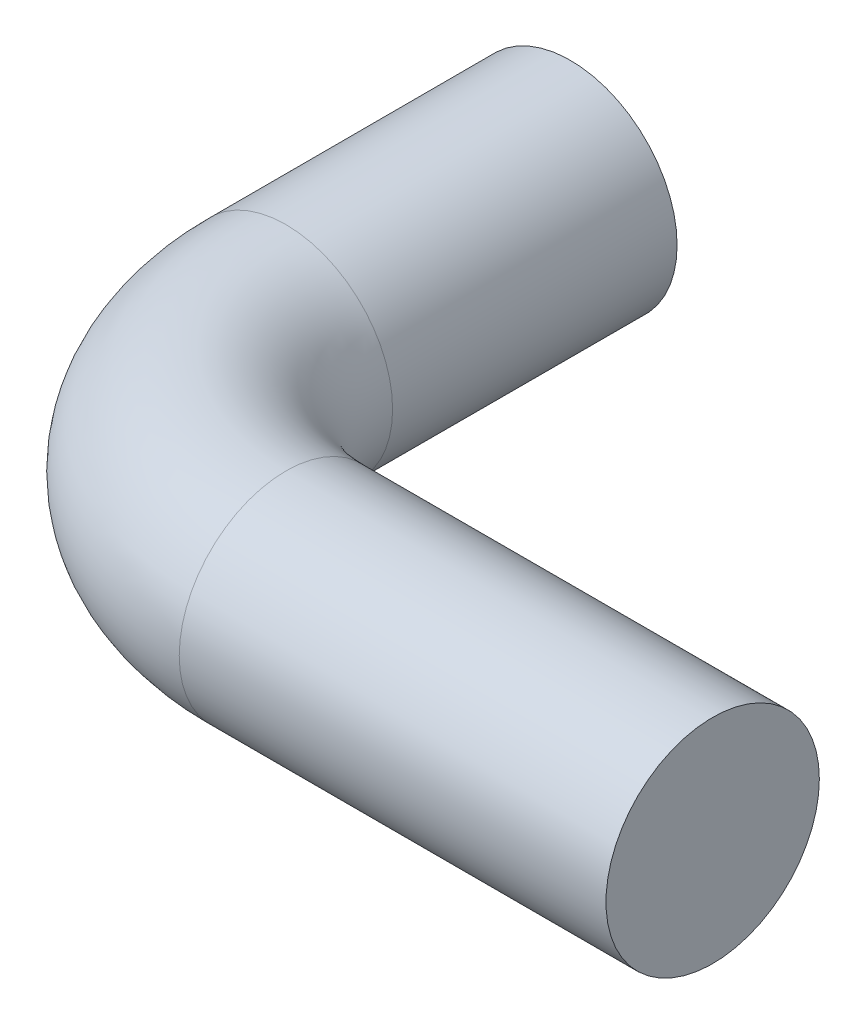
ISO-10303-21;
HEADER;
FILE_DESCRIPTION(('STEP AP214'),'2;1');
FILE_NAME('part.step','',(''),(''),'','','');
FILE_SCHEMA(('AUTOMOTIVE_DESIGN { 1 0 10303 214 1 1 1 1 }'));
ENDSEC;
DATA;
#1=APPLICATION_CONTEXT('core data for automotive mechanical design processes');
#2=APPLICATION_PROTOCOL_DEFINITION('international standard','automotive_design',2000,#1);
#3=PRODUCT_CONTEXT('',#1,'mechanical');
#4=PRODUCT('Part','Part','',(#3));
#5=PRODUCT_RELATED_PRODUCT_CATEGORY('part','',(#4));
#6=PRODUCT_DEFINITION_FORMATION('','',#4);
#7=PRODUCT_DEFINITION_CONTEXT('part definition',#1,'design');
#8=PRODUCT_DEFINITION('design','',#6,#7);
#9=PRODUCT_DEFINITION_SHAPE('','',#8);
#10=(LENGTH_UNIT() NAMED_UNIT(*) SI_UNIT(.MILLI.,.METRE.));
#11=(NAMED_UNIT(*) PLANE_ANGLE_UNIT() SI_UNIT($,.RADIAN.));
#12=(NAMED_UNIT(*) SI_UNIT($,.STERADIAN.) SOLID_ANGLE_UNIT());
#13=UNCERTAINTY_MEASURE_WITH_UNIT(LENGTH_MEASURE(1.E-05),#10,'distance_accuracy_value','');
#14=(GEOMETRIC_REPRESENTATION_CONTEXT(3) GLOBAL_UNCERTAINTY_ASSIGNED_CONTEXT((#13)) GLOBAL_UNIT_ASSIGNED_CONTEXT((#10,
#11,#12)) REPRESENTATION_CONTEXT('',''));
#15=CARTESIAN_POINT('',(0.,0.,0.));
#16=DIRECTION('',(0.,0.,1.));
#17=DIRECTION('',(1.,0.,0.));
#18=AXIS2_PLACEMENT_3D('',#15,#16,#17);
#19=CARTESIAN_POINT('',(-75.,0.,-175.));
#20=DIRECTION('',(0.,0.,1.));
#21=DIRECTION('',(1.,0.,0.));
#22=AXIS2_PLACEMENT_3D('',#19,#20,#21);
#23=PLANE('',#22);
#24=CARTESIAN_POINT('',(-75.,0.,-175.));
#25=DIRECTION('',(0.,0.,1.));
#26=DIRECTION('',(1.,0.,0.));
#27=AXIS2_PLACEMENT_3D('',#24,#25,#26);
#28=CIRCLE('',#27,37.5);
#29=CARTESIAN_POINT('',(-37.5,0.,-175.));
#30=VERTEX_POINT('',#29);
#31=EDGE_CURVE('E70',#30,#30,#28,.T.);
#32=ORIENTED_EDGE('',*,*,#31,.F.);
#33=EDGE_LOOP('',(#32));
#34=FACE_BOUND('',#33,.T.);
#35=ADVANCED_FACE('F53',(#34),#23,.F.);
#36=CARTESIAN_POINT('',(150.,0.,0.));
#37=DIRECTION('',(1.,0.,0.));
#38=DIRECTION('',(0.,0.,-1.));
#39=AXIS2_PLACEMENT_3D('',#36,#37,#38);
#40=PLANE('',#39);
#41=CARTESIAN_POINT('',(150.,0.,0.));
#42=DIRECTION('',(1.,0.,0.));
#43=DIRECTION('',(0.,0.,-1.));
#44=AXIS2_PLACEMENT_3D('',#41,#42,#43);
#45=CIRCLE('',#44,37.5);
#46=CARTESIAN_POINT('',(150.,0.,-37.5));
#47=VERTEX_POINT('',#46);
#48=EDGE_CURVE('E11',#47,#47,#45,.T.);
#49=ORIENTED_EDGE('',*,*,#48,.T.);
#50=EDGE_LOOP('',(#49));
#51=FACE_BOUND('',#50,.T.);
#52=ADVANCED_FACE('F80',(#51),#40,.T.);
#53=CARTESIAN_POINT('',(-75.,0.,-175.));
#54=DIRECTION('',(0.,0.,1.));
#55=DIRECTION('',(1.,0.,0.));
#56=AXIS2_PLACEMENT_3D('',#53,#54,#55);
#57=CYLINDRICAL_SURFACE('',#56,37.5);
#58=CARTESIAN_POINT('',(-75.,0.,-75.));
#59=DIRECTION('',(0.,0.,1.));
#60=DIRECTION('',(1.,0.,0.));
#61=AXIS2_PLACEMENT_3D('',#58,#59,#60);
#62=CIRCLE('',#61,37.5);
#63=CARTESIAN_POINT('',(-112.5,0.,-75.0000000000001));
#64=VERTEX_POINT('',#63);
#65=EDGE_CURVE('E65',#64,#64,#62,.T.);
#66=ORIENTED_EDGE('',*,*,#65,.F.);
#67=EDGE_LOOP('',(#66));
#68=FACE_BOUND('',#67,.T.);
#69=ORIENTED_EDGE('',*,*,#31,.T.);
#70=EDGE_LOOP('',(#69));
#71=FACE_BOUND('',#70,.T.);
#72=ADVANCED_FACE('F77',(#68,#71),#57,.T.);
#73=CARTESIAN_POINT('',(0.,0.,-75.));
#74=DIRECTION('',(0.,1.,0.));
#75=DIRECTION('',(0.,0.,1.));
#76=AXIS2_PLACEMENT_3D('',#73,#74,#75);
#77=TOROIDAL_SURFACE('',#76,75.0000000000001,37.5);
#78=CARTESIAN_POINT('',(0.,0.,0.));
#79=DIRECTION('',(1.,0.,0.));
#80=DIRECTION('',(0.,0.,-1.));
#81=AXIS2_PLACEMENT_3D('',#78,#79,#80);
#82=CIRCLE('',#81,37.5);
#83=CARTESIAN_POINT('',(0.,0.,37.5));
#84=VERTEX_POINT('',#83);
#85=EDGE_CURVE('E60',#84,#84,#82,.T.);
#86=CARTESIAN_POINT('',(0.,0.,-75.));
#87=DIRECTION('',(0.,1.,0.));
#88=DIRECTION('',(0.,0.,1.));
#89=AXIS2_PLACEMENT_3D('',#86,#87,#88);
#90=CIRCLE('',#89,112.5);
#91=EDGE_CURVE('',#64,#84,#90,.T.);
#92=ORIENTED_EDGE('',*,*,#65,.T.);
#93=ORIENTED_EDGE('',*,*,#85,.F.);
#94=ORIENTED_EDGE('',*,*,#91,.T.);
#95=ORIENTED_EDGE('',*,*,#91,.F.);
#96=EDGE_LOOP('',(#92,#94,#93,#95));
#97=FACE_BOUND('',#96,.T.);
#98=ADVANCED_FACE('F86',(#97),#77,.T.);
#99=CARTESIAN_POINT('',(0.,0.,0.));
#100=DIRECTION('',(1.,0.,0.));
#101=DIRECTION('',(0.,0.,-1.));
#102=AXIS2_PLACEMENT_3D('',#99,#100,#101);
#103=CYLINDRICAL_SURFACE('',#102,37.5);
#104=ORIENTED_EDGE('',*,*,#48,.F.);
#105=EDGE_LOOP('',(#104));
#106=FACE_BOUND('',#105,.T.);
#107=ORIENTED_EDGE('',*,*,#85,.T.);
#108=EDGE_LOOP('',(#107));
#109=FACE_BOUND('',#108,.T.);
#110=ADVANCED_FACE('F84',(#106,#109),#103,.T.);
#111=CLOSED_SHELL('',(#35,#52,#72,#98,#110));
#112=MANIFOLD_SOLID_BREP('B2',#111);
#113=ADVANCED_BREP_SHAPE_REPRESENTATION('',(#18,#112),#14);
#114=SHAPE_DEFINITION_REPRESENTATION(#9,#113);
ENDSEC;
END-ISO-10303-21;
